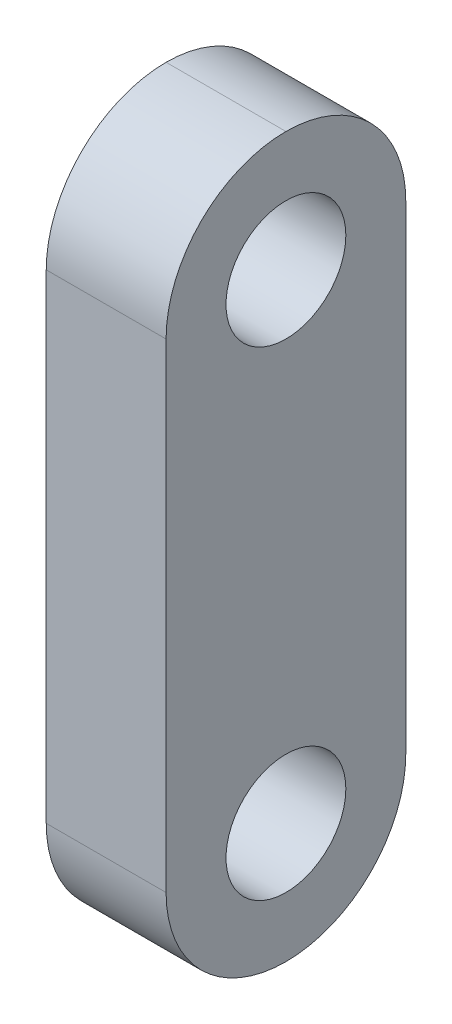
ISO-10303-21;
HEADER;
FILE_DESCRIPTION(('STEP AP214'),'2;1');
FILE_NAME('part.step','',(''),(''),'','','');
FILE_SCHEMA(('AUTOMOTIVE_DESIGN { 1 0 10303 214 1 1 1 1 }'));
ENDSEC;
DATA;
#1=APPLICATION_CONTEXT('core data for automotive mechanical design processes');
#2=APPLICATION_PROTOCOL_DEFINITION('international standard','automotive_design',2000,#1);
#3=PRODUCT_CONTEXT('',#1,'mechanical');
#4=PRODUCT('Part','Part','',(#3));
#5=PRODUCT_RELATED_PRODUCT_CATEGORY('part','',(#4));
#6=PRODUCT_DEFINITION_FORMATION('','',#4);
#7=PRODUCT_DEFINITION_CONTEXT('part definition',#1,'design');
#8=PRODUCT_DEFINITION('design','',#6,#7);
#9=PRODUCT_DEFINITION_SHAPE('','',#8);
#10=(LENGTH_UNIT() NAMED_UNIT(*) SI_UNIT(.MILLI.,.METRE.));
#11=(NAMED_UNIT(*) PLANE_ANGLE_UNIT() SI_UNIT($,.RADIAN.));
#12=(NAMED_UNIT(*) SI_UNIT($,.STERADIAN.) SOLID_ANGLE_UNIT());
#13=UNCERTAINTY_MEASURE_WITH_UNIT(LENGTH_MEASURE(1.E-05),#10,'distance_accuracy_value','');
#14=(GEOMETRIC_REPRESENTATION_CONTEXT(3) GLOBAL_UNCERTAINTY_ASSIGNED_CONTEXT((#13)) GLOBAL_UNIT_ASSIGNED_CONTEXT((#10,
#11,#12)) REPRESENTATION_CONTEXT('',''));
#15=CARTESIAN_POINT('',(0.,0.,0.));
#16=DIRECTION('',(0.,0.,1.));
#17=DIRECTION('',(1.,0.,0.));
#18=AXIS2_PLACEMENT_3D('',#15,#16,#17);
#19=CARTESIAN_POINT('',(-1.5875,-15.875,-3.175));
#20=DIRECTION('',(0.,0.,-1.));
#21=DIRECTION('',(-1.,0.,0.));
#22=AXIS2_PLACEMENT_3D('',#19,#20,#21);
#23=PLANE('',#22);
#24=DIRECTION('',(0.,1.,0.));
#25=VECTOR('',#24,1.);
#26=CARTESIAN_POINT('',(1.5875,-15.875,-3.175));
#27=LINE('',#26,#25);
#28=CARTESIAN_POINT('',(1.5875,-12.7,-3.175));
#29=VERTEX_POINT('',#28);
#30=CARTESIAN_POINT('',(1.5875,0.,-3.175));
#31=VERTEX_POINT('',#30);
#32=EDGE_CURVE('E104',#29,#31,#27,.T.);
#33=ORIENTED_EDGE('',*,*,#32,.F.);
#34=DIRECTION('',(1.,0.,0.));
#35=VECTOR('',#34,1.);
#36=CARTESIAN_POINT('',(-1.5875,-12.7,-3.175));
#37=LINE('',#36,#35);
#38=CARTESIAN_POINT('',(-1.5875,-12.7,-3.175));
#39=VERTEX_POINT('',#38);
#40=EDGE_CURVE('E119',#29,#39,#37,.F.);
#41=ORIENTED_EDGE('',*,*,#40,.T.);
#42=DIRECTION('',(0.,1.,0.));
#43=VECTOR('',#42,1.);
#44=CARTESIAN_POINT('',(-1.5875,-15.875,-3.175));
#45=LINE('',#44,#43);
#46=CARTESIAN_POINT('',(-1.5875,0.,-3.175));
#47=VERTEX_POINT('',#46);
#48=EDGE_CURVE('E166',#39,#47,#45,.T.);
#49=ORIENTED_EDGE('',*,*,#48,.T.);
#50=DIRECTION('',(1.,0.,0.));
#51=VECTOR('',#50,1.);
#52=CARTESIAN_POINT('',(-1.5875,0.,-3.175));
#53=LINE('',#52,#51);
#54=EDGE_CURVE('E113',#47,#31,#53,.T.);
#55=ORIENTED_EDGE('',*,*,#54,.T.);
#56=EDGE_LOOP('',(#33,#41,#49,#55));
#57=FACE_BOUND('',#56,.T.);
#58=ADVANCED_FACE('F45',(#57),#23,.T.);
#59=CARTESIAN_POINT('',(-1.5875,-15.875,3.175));
#60=DIRECTION('',(0.,0.,1.));
#61=DIRECTION('',(1.,0.,0.));
#62=AXIS2_PLACEMENT_3D('',#59,#60,#61);
#63=PLANE('',#62);
#64=DIRECTION('',(0.,-1.,0.));
#65=VECTOR('',#64,1.);
#66=CARTESIAN_POINT('',(-1.5875,-15.875,3.175));
#67=LINE('',#66,#65);
#68=CARTESIAN_POINT('',(-1.5875,0.,3.175));
#69=VERTEX_POINT('',#68);
#70=CARTESIAN_POINT('',(-1.5875,-12.7,3.175));
#71=VERTEX_POINT('',#70);
#72=EDGE_CURVE('E161',#69,#71,#67,.T.);
#73=ORIENTED_EDGE('',*,*,#72,.T.);
#74=DIRECTION('',(1.,0.,0.));
#75=VECTOR('',#74,1.);
#76=CARTESIAN_POINT('',(-1.5875,-12.7,3.175));
#77=LINE('',#76,#75);
#78=CARTESIAN_POINT('',(1.5875,-12.7,3.175));
#79=VERTEX_POINT('',#78);
#80=EDGE_CURVE('E11',#71,#79,#77,.T.);
#81=ORIENTED_EDGE('',*,*,#80,.T.);
#82=DIRECTION('',(0.,-1.,0.));
#83=VECTOR('',#82,1.);
#84=CARTESIAN_POINT('',(1.5875,-15.875,3.175));
#85=LINE('',#84,#83);
#86=CARTESIAN_POINT('',(1.5875,0.,3.175));
#87=VERTEX_POINT('',#86);
#88=EDGE_CURVE('E123',#87,#79,#85,.T.);
#89=ORIENTED_EDGE('',*,*,#88,.F.);
#90=DIRECTION('',(1.,0.,0.));
#91=VECTOR('',#90,1.);
#92=CARTESIAN_POINT('',(-1.5875,0.,3.175));
#93=LINE('',#92,#91);
#94=EDGE_CURVE('E55',#87,#69,#93,.F.);
#95=ORIENTED_EDGE('',*,*,#94,.T.);
#96=EDGE_LOOP('',(#73,#81,#89,#95));
#97=FACE_BOUND('',#96,.T.);
#98=ADVANCED_FACE('F206',(#97),#63,.T.);
#99=CARTESIAN_POINT('',(-1.5875,0.,0.));
#100=DIRECTION('',(-1.,0.,0.));
#101=DIRECTION('',(0.,0.,1.));
#102=AXIS2_PLACEMENT_3D('',#99,#100,#101);
#103=PLANE('',#102);
#104=CARTESIAN_POINT('',(-1.5875,-12.7,0.));
#105=DIRECTION('',(1.,0.,0.));
#106=DIRECTION('',(0.,0.,-1.));
#107=AXIS2_PLACEMENT_3D('',#104,#105,#106);
#108=CIRCLE('',#107,1.5875);
#109=CARTESIAN_POINT('',(-1.5875,-12.7,-1.5875));
#110=VERTEX_POINT('',#109);
#111=EDGE_CURVE('E177',#110,#110,#108,.T.);
#112=ORIENTED_EDGE('',*,*,#111,.T.);
#113=EDGE_LOOP('',(#112));
#114=FACE_BOUND('',#113,.T.);
#115=CARTESIAN_POINT('',(-1.5875,0.,0.));
#116=DIRECTION('',(1.,0.,0.));
#117=DIRECTION('',(0.,0.,-1.));
#118=AXIS2_PLACEMENT_3D('',#115,#116,#117);
#119=CIRCLE('',#118,1.5875);
#120=CARTESIAN_POINT('',(-1.5875,0.,-1.5875));
#121=VERTEX_POINT('',#120);
#122=EDGE_CURVE('E173',#121,#121,#119,.T.);
#123=ORIENTED_EDGE('',*,*,#122,.T.);
#124=EDGE_LOOP('',(#123));
#125=FACE_BOUND('',#124,.T.);
#126=ORIENTED_EDGE('',*,*,#48,.F.);
#127=CARTESIAN_POINT('',(-1.5875,-12.7,0.));
#128=DIRECTION('',(-1.,0.,0.));
#129=DIRECTION('',(0.,0.,1.));
#130=AXIS2_PLACEMENT_3D('',#127,#128,#129);
#131=CIRCLE('',#130,3.175);
#132=CARTESIAN_POINT('',(-1.5875,-15.875,0.));
#133=VERTEX_POINT('',#132);
#134=EDGE_CURVE('E127',#39,#133,#131,.T.);
#135=ORIENTED_EDGE('',*,*,#134,.T.);
#136=CARTESIAN_POINT('',(-1.5875,-12.7,0.));
#137=DIRECTION('',(-1.,0.,0.));
#138=DIRECTION('',(0.,0.,1.));
#139=AXIS2_PLACEMENT_3D('',#136,#137,#138);
#140=CIRCLE('',#139,3.175);
#141=EDGE_CURVE('E69',#133,#71,#140,.T.);
#142=ORIENTED_EDGE('',*,*,#141,.T.);
#143=ORIENTED_EDGE('',*,*,#72,.F.);
#144=CARTESIAN_POINT('',(-1.5875,0.,0.));
#145=DIRECTION('',(-1.,0.,0.));
#146=DIRECTION('',(0.,0.,1.));
#147=AXIS2_PLACEMENT_3D('',#144,#145,#146);
#148=CIRCLE('',#147,3.175);
#149=CARTESIAN_POINT('',(-1.5875,3.175,0.));
#150=VERTEX_POINT('',#149);
#151=EDGE_CURVE('E63',#69,#150,#148,.T.);
#152=ORIENTED_EDGE('',*,*,#151,.T.);
#153=CARTESIAN_POINT('',(-1.5875,0.,0.));
#154=DIRECTION('',(-1.,0.,0.));
#155=DIRECTION('',(0.,0.,1.));
#156=AXIS2_PLACEMENT_3D('',#153,#154,#155);
#157=CIRCLE('',#156,3.175);
#158=EDGE_CURVE('E132',#150,#47,#157,.T.);
#159=ORIENTED_EDGE('',*,*,#158,.T.);
#160=EDGE_LOOP('',(#126,#135,#142,#143,#152,#159));
#161=FACE_BOUND('',#160,.T.);
#162=ADVANCED_FACE('F202',(#114,#125,#161),#103,.T.);
#163=CARTESIAN_POINT('',(-1.5875,0.,0.));
#164=DIRECTION('',(1.,0.,0.));
#165=DIRECTION('',(0.,0.,-1.));
#166=AXIS2_PLACEMENT_3D('',#163,#164,#165);
#167=CYLINDRICAL_SURFACE('',#166,1.5875);
#168=ORIENTED_EDGE('',*,*,#122,.F.);
#169=EDGE_LOOP('',(#168));
#170=FACE_BOUND('',#169,.T.);
#171=CARTESIAN_POINT('',(1.5875,0.,0.));
#172=DIRECTION('',(1.,0.,0.));
#173=DIRECTION('',(0.,0.,-1.));
#174=AXIS2_PLACEMENT_3D('',#171,#172,#173);
#175=CIRCLE('',#174,1.5875);
#176=CARTESIAN_POINT('',(1.5875,0.,-1.5875));
#177=VERTEX_POINT('',#176);
#178=EDGE_CURVE('E124',#177,#177,#175,.T.);
#179=ORIENTED_EDGE('',*,*,#178,.T.);
#180=EDGE_LOOP('',(#179));
#181=FACE_BOUND('',#180,.T.);
#182=ADVANCED_FACE('F187',(#170,#181),#167,.F.);
#183=CARTESIAN_POINT('',(-1.5875,-12.7,0.));
#184=DIRECTION('',(1.,0.,0.));
#185=DIRECTION('',(0.,0.,-1.));
#186=AXIS2_PLACEMENT_3D('',#183,#184,#185);
#187=CYLINDRICAL_SURFACE('',#186,1.5875);
#188=ORIENTED_EDGE('',*,*,#111,.F.);
#189=EDGE_LOOP('',(#188));
#190=FACE_BOUND('',#189,.T.);
#191=CARTESIAN_POINT('',(1.5875,-12.7,0.));
#192=DIRECTION('',(1.,0.,0.));
#193=DIRECTION('',(0.,0.,-1.));
#194=AXIS2_PLACEMENT_3D('',#191,#192,#193);
#195=CIRCLE('',#194,1.5875);
#196=CARTESIAN_POINT('',(1.5875,-12.7,-1.5875));
#197=VERTEX_POINT('',#196);
#198=EDGE_CURVE('E145',#197,#197,#195,.T.);
#199=ORIENTED_EDGE('',*,*,#198,.T.);
#200=EDGE_LOOP('',(#199));
#201=FACE_BOUND('',#200,.T.);
#202=ADVANCED_FACE('F191',(#190,#201),#187,.F.);
#203=CARTESIAN_POINT('',(1.5875,0.,0.));
#204=DIRECTION('',(-1.,0.,0.));
#205=DIRECTION('',(0.,0.,1.));
#206=AXIS2_PLACEMENT_3D('',#203,#204,#205);
#207=PLANE('',#206);
#208=CARTESIAN_POINT('',(1.5875,-12.7,0.));
#209=DIRECTION('',(-1.,0.,0.));
#210=DIRECTION('',(0.,0.,1.));
#211=AXIS2_PLACEMENT_3D('',#208,#209,#210);
#212=CIRCLE('',#211,3.175);
#213=CARTESIAN_POINT('',(1.5875,-15.875,0.));
#214=VERTEX_POINT('',#213);
#215=EDGE_CURVE('E107',#79,#214,#212,.F.);
#216=ORIENTED_EDGE('',*,*,#215,.T.);
#217=CARTESIAN_POINT('',(1.5875,-12.7,0.));
#218=DIRECTION('',(-1.,0.,0.));
#219=DIRECTION('',(0.,0.,1.));
#220=AXIS2_PLACEMENT_3D('',#217,#218,#219);
#221=CIRCLE('',#220,3.175);
#222=EDGE_CURVE('E100',#214,#29,#221,.F.);
#223=ORIENTED_EDGE('',*,*,#222,.T.);
#224=ORIENTED_EDGE('',*,*,#32,.T.);
#225=CARTESIAN_POINT('',(1.5875,0.,0.));
#226=DIRECTION('',(-1.,0.,0.));
#227=DIRECTION('',(0.,0.,1.));
#228=AXIS2_PLACEMENT_3D('',#225,#226,#227);
#229=CIRCLE('',#228,3.175);
#230=CARTESIAN_POINT('',(1.5875,3.175,0.));
#231=VERTEX_POINT('',#230);
#232=EDGE_CURVE('E154',#31,#231,#229,.F.);
#233=ORIENTED_EDGE('',*,*,#232,.T.);
#234=CARTESIAN_POINT('',(1.5875,0.,0.));
#235=DIRECTION('',(-1.,0.,0.));
#236=DIRECTION('',(0.,0.,1.));
#237=AXIS2_PLACEMENT_3D('',#234,#235,#236);
#238=CIRCLE('',#237,3.175);
#239=EDGE_CURVE('E158',#231,#87,#238,.F.);
#240=ORIENTED_EDGE('',*,*,#239,.T.);
#241=ORIENTED_EDGE('',*,*,#88,.T.);
#242=EDGE_LOOP('',(#216,#223,#224,#233,#240,#241));
#243=FACE_BOUND('',#242,.T.);
#244=ORIENTED_EDGE('',*,*,#178,.F.);
#245=EDGE_LOOP('',(#244));
#246=FACE_BOUND('',#245,.T.);
#247=ORIENTED_EDGE('',*,*,#198,.F.);
#248=EDGE_LOOP('',(#247));
#249=FACE_BOUND('',#248,.T.);
#250=ADVANCED_FACE('F102',(#243,#246,#249),#207,.F.);
#251=CARTESIAN_POINT('',(-1.5875,-12.7,0.));
#252=DIRECTION('',(1.,0.,0.));
#253=DIRECTION('',(0.,0.,-1.));
#254=AXIS2_PLACEMENT_3D('',#251,#252,#253);
#255=CYLINDRICAL_SURFACE('',#254,3.175);
#256=ORIENTED_EDGE('',*,*,#80,.F.);
#257=ORIENTED_EDGE('',*,*,#141,.F.);
#258=DIRECTION('',(1.,0.,0.));
#259=VECTOR('',#258,1.);
#260=CARTESIAN_POINT('',(-1.5875,-15.875,0.));
#261=LINE('',#260,#259);
#262=EDGE_CURVE('E143',#214,#133,#261,.F.);
#263=ORIENTED_EDGE('',*,*,#262,.F.);
#264=ORIENTED_EDGE('',*,*,#215,.F.);
#265=EDGE_LOOP('',(#256,#257,#263,#264));
#266=FACE_BOUND('',#265,.T.);
#267=ADVANCED_FACE('F190',(#266),#255,.T.);
#268=CARTESIAN_POINT('',(-1.5875,-12.7,0.));
#269=DIRECTION('',(1.,0.,0.));
#270=DIRECTION('',(0.,0.,-1.));
#271=AXIS2_PLACEMENT_3D('',#268,#269,#270);
#272=CYLINDRICAL_SURFACE('',#271,3.175);
#273=ORIENTED_EDGE('',*,*,#134,.F.);
#274=ORIENTED_EDGE('',*,*,#40,.F.);
#275=ORIENTED_EDGE('',*,*,#222,.F.);
#276=ORIENTED_EDGE('',*,*,#262,.T.);
#277=EDGE_LOOP('',(#273,#274,#275,#276));
#278=FACE_BOUND('',#277,.T.);
#279=ADVANCED_FACE('F126',(#278),#272,.T.);
#280=CARTESIAN_POINT('',(-1.5875,0.,0.));
#281=DIRECTION('',(1.,0.,0.));
#282=DIRECTION('',(0.,0.,-1.));
#283=AXIS2_PLACEMENT_3D('',#280,#281,#282);
#284=CYLINDRICAL_SURFACE('',#283,3.175);
#285=DIRECTION('',(1.,0.,0.));
#286=VECTOR('',#285,1.);
#287=CARTESIAN_POINT('',(-1.5875,3.175,0.));
#288=LINE('',#287,#286);
#289=EDGE_CURVE('E49',#150,#231,#288,.T.);
#290=ORIENTED_EDGE('',*,*,#289,.F.);
#291=ORIENTED_EDGE('',*,*,#151,.F.);
#292=ORIENTED_EDGE('',*,*,#94,.F.);
#293=ORIENTED_EDGE('',*,*,#239,.F.);
#294=EDGE_LOOP('',(#290,#291,#292,#293));
#295=FACE_BOUND('',#294,.T.);
#296=ADVANCED_FACE('F47',(#295),#284,.T.);
#297=CARTESIAN_POINT('',(-1.5875,0.,0.));
#298=DIRECTION('',(1.,0.,0.));
#299=DIRECTION('',(0.,0.,-1.));
#300=AXIS2_PLACEMENT_3D('',#297,#298,#299);
#301=CYLINDRICAL_SURFACE('',#300,3.175);
#302=ORIENTED_EDGE('',*,*,#158,.F.);
#303=ORIENTED_EDGE('',*,*,#289,.T.);
#304=ORIENTED_EDGE('',*,*,#232,.F.);
#305=ORIENTED_EDGE('',*,*,#54,.F.);
#306=EDGE_LOOP('',(#302,#303,#304,#305));
#307=FACE_BOUND('',#306,.T.);
#308=ADVANCED_FACE('F153',(#307),#301,.T.);
#309=CLOSED_SHELL('',(#58,#98,#162,#182,#202,#250,#267,#279,#296,#308));
#310=MANIFOLD_SOLID_BREP('B2',#309);
#311=ADVANCED_BREP_SHAPE_REPRESENTATION('',(#18,#310),#14);
#312=SHAPE_DEFINITION_REPRESENTATION(#9,#311);
ENDSEC;
END-ISO-10303-21;
